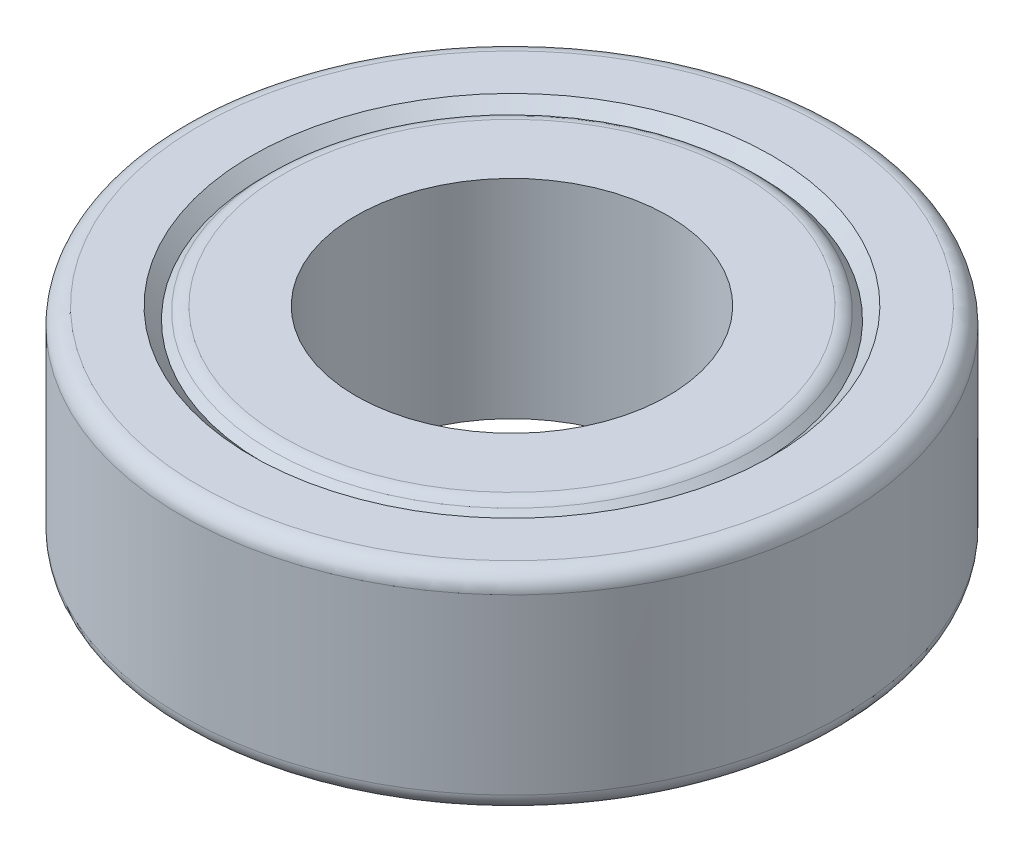
ISO-10303-21;
HEADER;
FILE_DESCRIPTION(('STEP AP214'),'2;1');
FILE_NAME('part.step','',(''),(''),'','','');
FILE_SCHEMA(('AUTOMOTIVE_DESIGN { 1 0 10303 214 1 1 1 1 }'));
ENDSEC;
DATA;
#1=APPLICATION_CONTEXT('core data for automotive mechanical design processes');
#2=APPLICATION_PROTOCOL_DEFINITION('international standard','automotive_design',2000,#1);
#3=PRODUCT_CONTEXT('',#1,'mechanical');
#4=PRODUCT('Part','Part','',(#3));
#5=PRODUCT_RELATED_PRODUCT_CATEGORY('part','',(#4));
#6=PRODUCT_DEFINITION_FORMATION('','',#4);
#7=PRODUCT_DEFINITION_CONTEXT('part definition',#1,'design');
#8=PRODUCT_DEFINITION('design','',#6,#7);
#9=PRODUCT_DEFINITION_SHAPE('','',#8);
#10=(LENGTH_UNIT() NAMED_UNIT(*) SI_UNIT(.MILLI.,.METRE.));
#11=(NAMED_UNIT(*) PLANE_ANGLE_UNIT() SI_UNIT($,.RADIAN.));
#12=(NAMED_UNIT(*) SI_UNIT($,.STERADIAN.) SOLID_ANGLE_UNIT());
#13=UNCERTAINTY_MEASURE_WITH_UNIT(LENGTH_MEASURE(1.E-05),#10,'distance_accuracy_value','');
#14=(GEOMETRIC_REPRESENTATION_CONTEXT(3) GLOBAL_UNCERTAINTY_ASSIGNED_CONTEXT((#13)) GLOBAL_UNIT_ASSIGNED_CONTEXT((#10,
#11,#12)) REPRESENTATION_CONTEXT('',''));
#15=CARTESIAN_POINT('',(0.,0.,0.));
#16=DIRECTION('',(0.,0.,1.));
#17=DIRECTION('',(1.,0.,0.));
#18=AXIS2_PLACEMENT_3D('',#15,#16,#17);
#19=CARTESIAN_POINT('',(-9.5,3.,0.));
#20=DIRECTION('',(0.,-1.,0.));
#21=DIRECTION('',(0.,0.,-1.));
#22=AXIS2_PLACEMENT_3D('',#19,#20,#21);
#23=PLANE('',#22);
#24=CARTESIAN_POINT('',(0.,3.,0.));
#25=DIRECTION('',(0.,-1.,0.));
#26=DIRECTION('',(0.,0.,-1.));
#27=AXIS2_PLACEMENT_3D('',#24,#25,#26);
#28=CIRCLE('',#27,9.);
#29=CARTESIAN_POINT('',(0.,3.,-9.));
#30=VERTEX_POINT('',#29);
#31=EDGE_CURVE('E10',#30,#30,#28,.F.);
#32=ORIENTED_EDGE('',*,*,#31,.T.);
#33=EDGE_LOOP('',(#32));
#34=FACE_BOUND('',#33,.T.);
#35=CARTESIAN_POINT('',(0.,3.,0.));
#36=DIRECTION('',(0.,-1.,0.));
#37=DIRECTION('',(0.,0.,-1.));
#38=AXIS2_PLACEMENT_3D('',#35,#36,#37);
#39=CIRCLE('',#38,7.5);
#40=CARTESIAN_POINT('',(0.,3.,-7.5));
#41=VERTEX_POINT('',#40);
#42=EDGE_CURVE('E75',#41,#41,#39,.T.);
#43=ORIENTED_EDGE('',*,*,#42,.T.);
#44=EDGE_LOOP('',(#43));
#45=FACE_BOUND('',#44,.T.);
#46=ADVANCED_FACE('F37',(#34,#45),#23,.F.);
#47=CARTESIAN_POINT('',(0.,2.64644660940673,0.));
#48=DIRECTION('',(0.,1.,0.));
#49=DIRECTION('',(0.,0.,1.));
#50=AXIS2_PLACEMENT_3D('',#47,#48,#49);
#51=CONICAL_SURFACE('',#50,7.14644660940673,0.785398163397447);
#52=ORIENTED_EDGE('',*,*,#42,.F.);
#53=EDGE_LOOP('',(#52));
#54=FACE_BOUND('',#53,.T.);
#55=CARTESIAN_POINT('',(0.,2.64644660940673,0.));
#56=DIRECTION('',(0.,-1.,0.));
#57=DIRECTION('',(0.,0.,-1.));
#58=AXIS2_PLACEMENT_3D('',#55,#56,#57);
#59=CIRCLE('',#58,7.14644660940673);
#60=CARTESIAN_POINT('',(0.,2.64644660940673,-7.14644660940673));
#61=VERTEX_POINT('',#60);
#62=EDGE_CURVE('E79',#61,#61,#59,.T.);
#63=ORIENTED_EDGE('',*,*,#62,.T.);
#64=EDGE_LOOP('',(#63));
#65=FACE_BOUND('',#64,.T.);
#66=ADVANCED_FACE('F115',(#54,#65),#51,.F.);
#67=CARTESIAN_POINT('',(0.,3.,0.));
#68=DIRECTION('',(0.,-1.,0.));
#69=DIRECTION('',(0.,0.,-1.));
#70=AXIS2_PLACEMENT_3D('',#67,#68,#69);
#71=CONICAL_SURFACE('',#70,6.79289321881345,0.785398163397448);
#72=CARTESIAN_POINT('',(0.,2.85355339059327,0.));
#73=DIRECTION('',(0.,1.,0.));
#74=DIRECTION('',(0.,0.,1.));
#75=AXIS2_PLACEMENT_3D('',#72,#73,#74);
#76=CIRCLE('',#75,6.93933982822018);
#77=CARTESIAN_POINT('',(0.,2.85355339059327,6.93933982822018));
#78=VERTEX_POINT('',#77);
#79=EDGE_CURVE('E63',#78,#78,#76,.F.);
#80=ORIENTED_EDGE('',*,*,#79,.T.);
#81=EDGE_LOOP('',(#80));
#82=FACE_BOUND('',#81,.T.);
#83=ORIENTED_EDGE('',*,*,#62,.F.);
#84=EDGE_LOOP('',(#83));
#85=FACE_BOUND('',#84,.T.);
#86=ADVANCED_FACE('F120',(#82,#85),#71,.T.);
#87=CARTESIAN_POINT('',(-6.79289321881345,3.,0.));
#88=DIRECTION('',(0.,-1.,0.));
#89=DIRECTION('',(0.,0.,-1.));
#90=AXIS2_PLACEMENT_3D('',#87,#88,#89);
#91=PLANE('',#90);
#92=CARTESIAN_POINT('',(0.,3.,0.));
#93=DIRECTION('',(0.,-1.,0.));
#94=DIRECTION('',(0.,0.,-1.));
#95=AXIS2_PLACEMENT_3D('',#92,#93,#94);
#96=CIRCLE('',#95,6.58578643762691);
#97=CARTESIAN_POINT('',(0.,3.,-6.58578643762691));
#98=VERTEX_POINT('',#97);
#99=EDGE_CURVE('E60',#98,#98,#96,.F.);
#100=ORIENTED_EDGE('',*,*,#99,.T.);
#101=EDGE_LOOP('',(#100));
#102=FACE_BOUND('',#101,.T.);
#103=CARTESIAN_POINT('',(0.,3.,0.));
#104=DIRECTION('',(0.,-1.,0.));
#105=DIRECTION('',(0.,0.,-1.));
#106=AXIS2_PLACEMENT_3D('',#103,#104,#105);
#107=CIRCLE('',#106,4.5);
#108=CARTESIAN_POINT('',(0.,3.,-4.5));
#109=VERTEX_POINT('',#108);
#110=EDGE_CURVE('E83',#109,#109,#107,.T.);
#111=ORIENTED_EDGE('',*,*,#110,.T.);
#112=EDGE_LOOP('',(#111));
#113=FACE_BOUND('',#112,.T.);
#114=ADVANCED_FACE('F192',(#102,#113),#91,.F.);
#115=CARTESIAN_POINT('',(0.,0.,0.));
#116=DIRECTION('',(0.,-1.,0.));
#117=DIRECTION('',(0.,0.,-1.));
#118=AXIS2_PLACEMENT_3D('',#115,#116,#117);
#119=CYLINDRICAL_SURFACE('',#118,4.5);
#120=ORIENTED_EDGE('',*,*,#110,.F.);
#121=EDGE_LOOP('',(#120));
#122=FACE_BOUND('',#121,.T.);
#123=CARTESIAN_POINT('',(0.,-3.,0.));
#124=DIRECTION('',(0.,-1.,0.));
#125=DIRECTION('',(0.,0.,-1.));
#126=AXIS2_PLACEMENT_3D('',#123,#124,#125);
#127=CIRCLE('',#126,4.5);
#128=CARTESIAN_POINT('',(0.,-3.,-4.5));
#129=VERTEX_POINT('',#128);
#130=EDGE_CURVE('E86',#129,#129,#127,.T.);
#131=ORIENTED_EDGE('',*,*,#130,.T.);
#132=EDGE_LOOP('',(#131));
#133=FACE_BOUND('',#132,.T.);
#134=ADVANCED_FACE('F188',(#122,#133),#119,.F.);
#135=CARTESIAN_POINT('',(-6.79289321881345,-3.,0.));
#136=DIRECTION('',(0.,1.,0.));
#137=DIRECTION('',(0.,0.,1.));
#138=AXIS2_PLACEMENT_3D('',#135,#136,#137);
#139=PLANE('',#138);
#140=CARTESIAN_POINT('',(0.,-3.,0.));
#141=DIRECTION('',(0.,1.,0.));
#142=DIRECTION('',(0.,0.,1.));
#143=AXIS2_PLACEMENT_3D('',#140,#141,#142);
#144=CIRCLE('',#143,6.5857864376269);
#145=CARTESIAN_POINT('',(0.,-3.,6.5857864376269));
#146=VERTEX_POINT('',#145);
#147=EDGE_CURVE('E71',#146,#146,#144,.F.);
#148=ORIENTED_EDGE('',*,*,#147,.T.);
#149=EDGE_LOOP('',(#148));
#150=FACE_BOUND('',#149,.T.);
#151=ORIENTED_EDGE('',*,*,#130,.F.);
#152=EDGE_LOOP('',(#151));
#153=FACE_BOUND('',#152,.T.);
#154=ADVANCED_FACE('F176',(#150,#153),#139,.F.);
#155=CARTESIAN_POINT('',(0.,-2.64644660940673,0.));
#156=DIRECTION('',(0.,1.,0.));
#157=DIRECTION('',(0.,0.,1.));
#158=AXIS2_PLACEMENT_3D('',#155,#156,#157);
#159=CONICAL_SURFACE('',#158,7.14644660940673,0.785398163397448);
#160=CARTESIAN_POINT('',(0.,-2.85355339059327,0.));
#161=DIRECTION('',(0.,-1.,0.));
#162=DIRECTION('',(0.,0.,-1.));
#163=AXIS2_PLACEMENT_3D('',#160,#161,#162);
#164=CIRCLE('',#163,6.93933982822018);
#165=CARTESIAN_POINT('',(0.,-2.85355339059327,-6.93933982822018));
#166=VERTEX_POINT('',#165);
#167=EDGE_CURVE('E67',#166,#166,#164,.F.);
#168=ORIENTED_EDGE('',*,*,#167,.T.);
#169=EDGE_LOOP('',(#168));
#170=FACE_BOUND('',#169,.T.);
#171=CARTESIAN_POINT('',(0.,-2.64644660940673,0.));
#172=DIRECTION('',(0.,-1.,0.));
#173=DIRECTION('',(0.,0.,-1.));
#174=AXIS2_PLACEMENT_3D('',#171,#172,#173);
#175=CIRCLE('',#174,7.14644660940673);
#176=CARTESIAN_POINT('',(0.,-2.64644660940673,-7.14644660940673));
#177=VERTEX_POINT('',#176);
#178=EDGE_CURVE('E89',#177,#177,#175,.T.);
#179=ORIENTED_EDGE('',*,*,#178,.T.);
#180=EDGE_LOOP('',(#179));
#181=FACE_BOUND('',#180,.T.);
#182=ADVANCED_FACE('F111',(#170,#181),#159,.T.);
#183=CARTESIAN_POINT('',(0.,-3.,0.));
#184=DIRECTION('',(0.,-1.,0.));
#185=DIRECTION('',(0.,0.,-1.));
#186=AXIS2_PLACEMENT_3D('',#183,#184,#185);
#187=CONICAL_SURFACE('',#186,7.5,0.785398163397447);
#188=ORIENTED_EDGE('',*,*,#178,.F.);
#189=EDGE_LOOP('',(#188));
#190=FACE_BOUND('',#189,.T.);
#191=CARTESIAN_POINT('',(0.,-3.,0.));
#192=DIRECTION('',(0.,-1.,0.));
#193=DIRECTION('',(0.,0.,-1.));
#194=AXIS2_PLACEMENT_3D('',#191,#192,#193);
#195=CIRCLE('',#194,7.5);
#196=CARTESIAN_POINT('',(0.,-3.,-7.5));
#197=VERTEX_POINT('',#196);
#198=EDGE_CURVE('E93',#197,#197,#195,.T.);
#199=ORIENTED_EDGE('',*,*,#198,.T.);
#200=EDGE_LOOP('',(#199));
#201=FACE_BOUND('',#200,.T.);
#202=ADVANCED_FACE('F98',(#190,#201),#187,.F.);
#203=CARTESIAN_POINT('',(-9.5,-3.,0.));
#204=DIRECTION('',(0.,1.,0.));
#205=DIRECTION('',(0.,0.,1.));
#206=AXIS2_PLACEMENT_3D('',#203,#204,#205);
#207=PLANE('',#206);
#208=CARTESIAN_POINT('',(0.,-3.,0.));
#209=DIRECTION('',(0.,1.,0.));
#210=DIRECTION('',(0.,0.,1.));
#211=AXIS2_PLACEMENT_3D('',#208,#209,#210);
#212=CIRCLE('',#211,9.);
#213=CARTESIAN_POINT('',(0.,-3.,9.));
#214=VERTEX_POINT('',#213);
#215=EDGE_CURVE('E55',#214,#214,#212,.F.);
#216=ORIENTED_EDGE('',*,*,#215,.T.);
#217=EDGE_LOOP('',(#216));
#218=FACE_BOUND('',#217,.T.);
#219=ORIENTED_EDGE('',*,*,#198,.F.);
#220=EDGE_LOOP('',(#219));
#221=FACE_BOUND('',#220,.T.);
#222=ADVANCED_FACE('F100',(#218,#221),#207,.F.);
#223=CARTESIAN_POINT('',(0.,0.,0.));
#224=DIRECTION('',(0.,-1.,0.));
#225=DIRECTION('',(0.,0.,-1.));
#226=AXIS2_PLACEMENT_3D('',#223,#224,#225);
#227=CYLINDRICAL_SURFACE('',#226,9.5);
#228=CARTESIAN_POINT('',(0.,-2.5,0.));
#229=DIRECTION('',(0.,1.,0.));
#230=DIRECTION('',(0.,0.,1.));
#231=AXIS2_PLACEMENT_3D('',#228,#229,#230);
#232=CIRCLE('',#231,9.5);
#233=CARTESIAN_POINT('',(0.,-2.5,9.5));
#234=VERTEX_POINT('',#233);
#235=EDGE_CURVE('E44',#234,#234,#232,.T.);
#236=ORIENTED_EDGE('',*,*,#235,.T.);
#237=EDGE_LOOP('',(#236));
#238=FACE_BOUND('',#237,.T.);
#239=CARTESIAN_POINT('',(0.,2.5,0.));
#240=DIRECTION('',(0.,-1.,0.));
#241=DIRECTION('',(0.,0.,-1.));
#242=AXIS2_PLACEMENT_3D('',#239,#240,#241);
#243=CIRCLE('',#242,9.5);
#244=CARTESIAN_POINT('',(0.,2.5,-9.5));
#245=VERTEX_POINT('',#244);
#246=EDGE_CURVE('E49',#245,#245,#243,.T.);
#247=ORIENTED_EDGE('',*,*,#246,.T.);
#248=EDGE_LOOP('',(#247));
#249=FACE_BOUND('',#248,.T.);
#250=ADVANCED_FACE('F102',(#238,#249),#227,.T.);
#251=CARTESIAN_POINT('',(0.,-2.5,0.));
#252=DIRECTION('',(0.,1.,0.));
#253=DIRECTION('',(0.,0.,1.));
#254=AXIS2_PLACEMENT_3D('',#251,#252,#253);
#255=TOROIDAL_SURFACE('',#254,6.5857864376269,0.5);
#256=ORIENTED_EDGE('',*,*,#167,.F.);
#257=EDGE_LOOP('',(#256));
#258=FACE_BOUND('',#257,.T.);
#259=ORIENTED_EDGE('',*,*,#147,.F.);
#260=EDGE_LOOP('',(#259));
#261=FACE_BOUND('',#260,.T.);
#262=ADVANCED_FACE('F109',(#258,#261),#255,.T.);
#263=CARTESIAN_POINT('',(0.,2.5,0.));
#264=DIRECTION('',(0.,-1.,0.));
#265=DIRECTION('',(0.,0.,-1.));
#266=AXIS2_PLACEMENT_3D('',#263,#264,#265);
#267=TOROIDAL_SURFACE('',#266,6.58578643762691,0.5);
#268=ORIENTED_EDGE('',*,*,#99,.F.);
#269=EDGE_LOOP('',(#268));
#270=FACE_BOUND('',#269,.T.);
#271=ORIENTED_EDGE('',*,*,#79,.F.);
#272=EDGE_LOOP('',(#271));
#273=FACE_BOUND('',#272,.T.);
#274=ADVANCED_FACE('F128',(#270,#273),#267,.T.);
#275=CARTESIAN_POINT('',(0.,-2.5,0.));
#276=DIRECTION('',(0.,1.,0.));
#277=DIRECTION('',(0.,0.,1.));
#278=AXIS2_PLACEMENT_3D('',#275,#276,#277);
#279=TOROIDAL_SURFACE('',#278,9.,0.5);
#280=ORIENTED_EDGE('',*,*,#235,.F.);
#281=EDGE_LOOP('',(#280));
#282=FACE_BOUND('',#281,.T.);
#283=ORIENTED_EDGE('',*,*,#215,.F.);
#284=EDGE_LOOP('',(#283));
#285=FACE_BOUND('',#284,.T.);
#286=ADVANCED_FACE('F131',(#282,#285),#279,.T.);
#287=CARTESIAN_POINT('',(0.,2.5,0.));
#288=DIRECTION('',(0.,-1.,0.));
#289=DIRECTION('',(0.,0.,-1.));
#290=AXIS2_PLACEMENT_3D('',#287,#288,#289);
#291=TOROIDAL_SURFACE('',#290,9.,0.5);
#292=ORIENTED_EDGE('',*,*,#31,.F.);
#293=EDGE_LOOP('',(#292));
#294=FACE_BOUND('',#293,.T.);
#295=ORIENTED_EDGE('',*,*,#246,.F.);
#296=EDGE_LOOP('',(#295));
#297=FACE_BOUND('',#296,.T.);
#298=ADVANCED_FACE('F39',(#294,#297),#291,.T.);
#299=CLOSED_SHELL('',(#46,#66,#86,#114,#134,#154,#182,#202,#222,#250,#262,#274,#286,#298));
#300=MANIFOLD_SOLID_BREP('B2',#299);
#301=ADVANCED_BREP_SHAPE_REPRESENTATION('',(#18,#300),#14);
#302=SHAPE_DEFINITION_REPRESENTATION(#9,#301);
ENDSEC;
END-ISO-10303-21;
